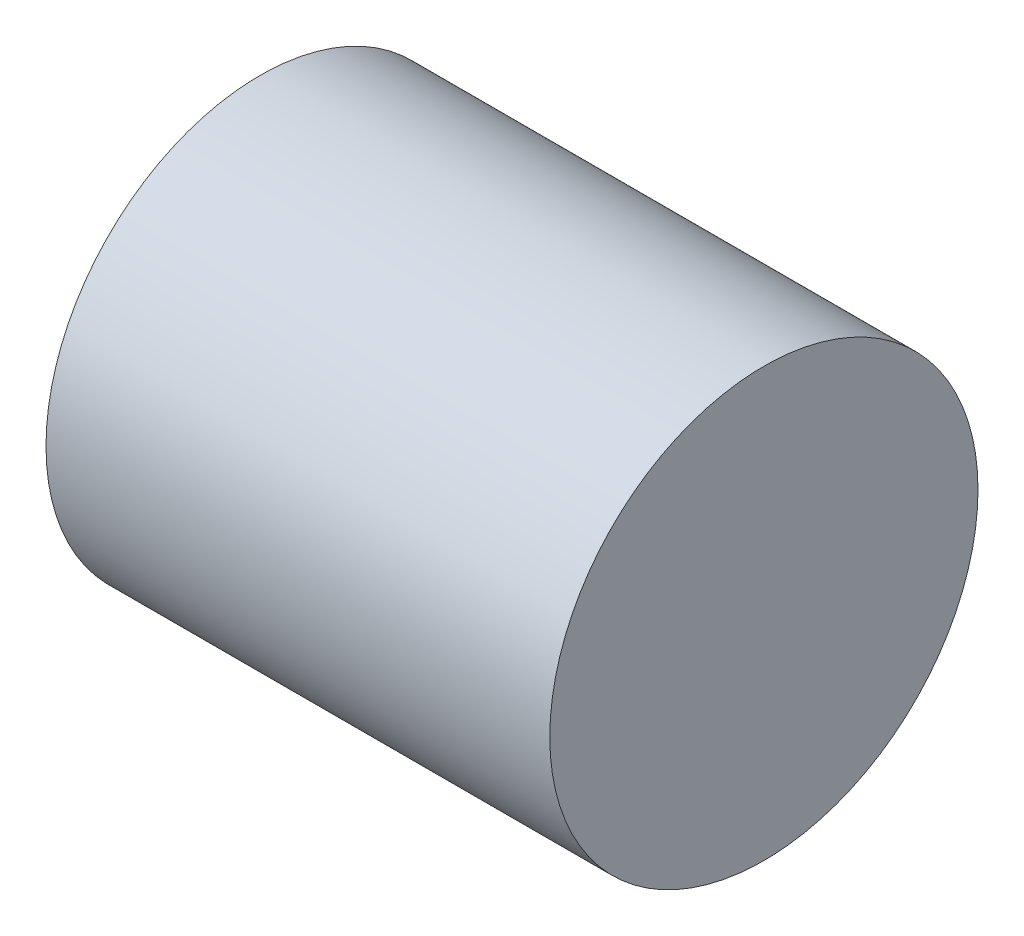
ISO-10303-21;
HEADER;
FILE_DESCRIPTION(('STEP AP214'),'2;1');
FILE_NAME('part.step','',(''),(''),'','','');
FILE_SCHEMA(('AUTOMOTIVE_DESIGN { 1 0 10303 214 1 1 1 1 }'));
ENDSEC;
DATA;
#1=APPLICATION_CONTEXT('core data for automotive mechanical design processes');
#2=APPLICATION_PROTOCOL_DEFINITION('international standard','automotive_design',2000,#1);
#3=PRODUCT_CONTEXT('',#1,'mechanical');
#4=PRODUCT('Part','Part','',(#3));
#5=PRODUCT_RELATED_PRODUCT_CATEGORY('part','',(#4));
#6=PRODUCT_DEFINITION_FORMATION('','',#4);
#7=PRODUCT_DEFINITION_CONTEXT('part definition',#1,'design');
#8=PRODUCT_DEFINITION('design','',#6,#7);
#9=PRODUCT_DEFINITION_SHAPE('','',#8);
#10=(LENGTH_UNIT() NAMED_UNIT(*) SI_UNIT(.MILLI.,.METRE.));
#11=(NAMED_UNIT(*) PLANE_ANGLE_UNIT() SI_UNIT($,.RADIAN.));
#12=(NAMED_UNIT(*) SI_UNIT($,.STERADIAN.) SOLID_ANGLE_UNIT());
#13=UNCERTAINTY_MEASURE_WITH_UNIT(LENGTH_MEASURE(1.E-05),#10,'distance_accuracy_value','');
#14=(GEOMETRIC_REPRESENTATION_CONTEXT(3) GLOBAL_UNCERTAINTY_ASSIGNED_CONTEXT((#13)) GLOBAL_UNIT_ASSIGNED_CONTEXT((#10,
#11,#12)) REPRESENTATION_CONTEXT('',''));
#15=CARTESIAN_POINT('',(0.,0.,0.));
#16=DIRECTION('',(0.,0.,1.));
#17=DIRECTION('',(1.,0.,0.));
#18=AXIS2_PLACEMENT_3D('',#15,#16,#17);
#19=CARTESIAN_POINT('',(50.,0.,0.));
#20=DIRECTION('',(-1.,0.,0.));
#21=DIRECTION('',(0.,0.,1.));
#22=AXIS2_PLACEMENT_3D('',#19,#20,#21);
#23=CYLINDRICAL_SURFACE('',#22,42.5);
#24=CARTESIAN_POINT('',(50.,0.,0.));
#25=DIRECTION('',(1.,0.,0.));
#26=DIRECTION('',(0.,0.,-1.));
#27=AXIS2_PLACEMENT_3D('',#24,#25,#26);
#28=CIRCLE('',#27,42.5);
#29=CARTESIAN_POINT('',(50.,0.,-42.5));
#30=VERTEX_POINT('',#29);
#31=EDGE_CURVE('E10',#30,#30,#28,.T.);
#32=ORIENTED_EDGE('',*,*,#31,.F.);
#33=EDGE_LOOP('',(#32));
#34=FACE_BOUND('',#33,.T.);
#35=CARTESIAN_POINT('',(-50.,0.,0.));
#36=DIRECTION('',(1.,0.,0.));
#37=DIRECTION('',(0.,0.,-1.));
#38=AXIS2_PLACEMENT_3D('',#35,#36,#37);
#39=CIRCLE('',#38,42.5);
#40=CARTESIAN_POINT('',(-50.,0.,-42.5));
#41=VERTEX_POINT('',#40);
#42=EDGE_CURVE('E36',#41,#41,#39,.T.);
#43=ORIENTED_EDGE('',*,*,#42,.T.);
#44=EDGE_LOOP('',(#43));
#45=FACE_BOUND('',#44,.T.);
#46=ADVANCED_FACE('F33',(#34,#45),#23,.T.);
#47=CARTESIAN_POINT('',(50.,0.,0.));
#48=DIRECTION('',(1.,0.,0.));
#49=DIRECTION('',(0.,0.,-1.));
#50=AXIS2_PLACEMENT_3D('',#47,#48,#49);
#51=PLANE('',#50);
#52=ORIENTED_EDGE('',*,*,#31,.T.);
#53=EDGE_LOOP('',(#52));
#54=FACE_BOUND('',#53,.T.);
#55=ADVANCED_FACE('F48',(#54),#51,.T.);
#56=CARTESIAN_POINT('',(-50.,0.,0.));
#57=DIRECTION('',(1.,0.,0.));
#58=DIRECTION('',(0.,0.,-1.));
#59=AXIS2_PLACEMENT_3D('',#56,#57,#58);
#60=PLANE('',#59);
#61=ORIENTED_EDGE('',*,*,#42,.F.);
#62=EDGE_LOOP('',(#61));
#63=FACE_BOUND('',#62,.T.);
#64=ADVANCED_FACE('F46',(#63),#60,.F.);
#65=CLOSED_SHELL('',(#46,#55,#64));
#66=MANIFOLD_SOLID_BREP('B2',#65);
#67=ADVANCED_BREP_SHAPE_REPRESENTATION('',(#18,#66),#14);
#68=SHAPE_DEFINITION_REPRESENTATION(#9,#67);
ENDSEC;
END-ISO-10303-21;
